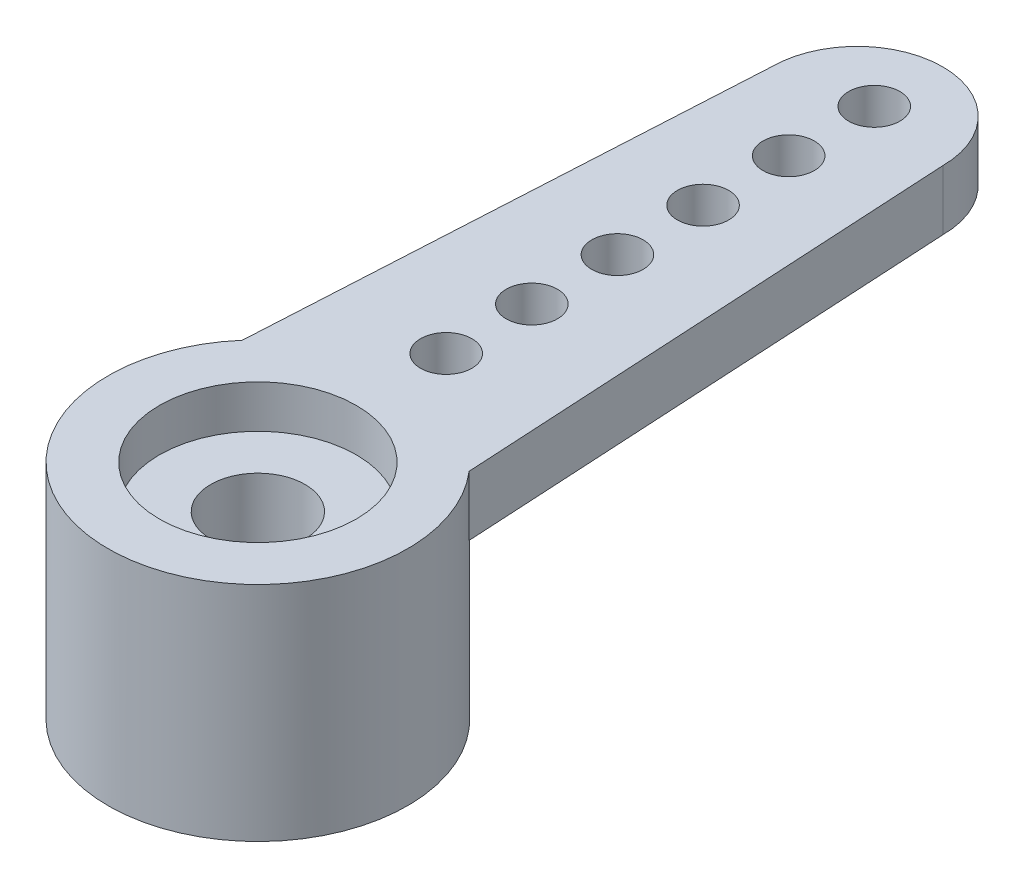
ISO-10303-21;
HEADER;
FILE_DESCRIPTION(('STEP AP214'),'2;1');
FILE_NAME('part.step','',(''),(''),'','','');
FILE_SCHEMA(('AUTOMOTIVE_DESIGN { 1 0 10303 214 1 1 1 1 }'));
ENDSEC;
DATA;
#1=APPLICATION_CONTEXT('core data for automotive mechanical design processes');
#2=APPLICATION_PROTOCOL_DEFINITION('international standard','automotive_design',2000,#1);
#3=PRODUCT_CONTEXT('',#1,'mechanical');
#4=PRODUCT('Part','Part','',(#3));
#5=PRODUCT_RELATED_PRODUCT_CATEGORY('part','',(#4));
#6=PRODUCT_DEFINITION_FORMATION('','',#4);
#7=PRODUCT_DEFINITION_CONTEXT('part definition',#1,'design');
#8=PRODUCT_DEFINITION('design','',#6,#7);
#9=PRODUCT_DEFINITION_SHAPE('','',#8);
#10=(LENGTH_UNIT() NAMED_UNIT(*) SI_UNIT(.MILLI.,.METRE.));
#11=(NAMED_UNIT(*) PLANE_ANGLE_UNIT() SI_UNIT($,.RADIAN.));
#12=(NAMED_UNIT(*) SI_UNIT($,.STERADIAN.) SOLID_ANGLE_UNIT());
#13=UNCERTAINTY_MEASURE_WITH_UNIT(LENGTH_MEASURE(1.E-05),#10,'distance_accuracy_value','');
#14=(GEOMETRIC_REPRESENTATION_CONTEXT(3) GLOBAL_UNCERTAINTY_ASSIGNED_CONTEXT((#13)) GLOBAL_UNIT_ASSIGNED_CONTEXT((#10,
#11,#12)) REPRESENTATION_CONTEXT('',''));
#15=CARTESIAN_POINT('',(0.,0.,0.));
#16=DIRECTION('',(0.,0.,1.));
#17=DIRECTION('',(1.,0.,0.));
#18=AXIS2_PLACEMENT_3D('',#15,#16,#17);
#19=CARTESIAN_POINT('',(-2.76834851479215,-1.4,-0.15361821615005));
#20=DIRECTION('',(-0.998463925245884,0.,-0.0554056854716381));
#21=DIRECTION('',(-0.0554056854716381,0.,0.998463925245884));
#22=AXIS2_PLACEMENT_3D('',#19,#20,#21);
#23=PLANE('',#22);
#24=DIRECTION('',(-0.0554056854716381,0.,0.998463925245884));
#25=VECTOR('',#24,1.);
#26=CARTESIAN_POINT('',(-2.76834851479215,0.,-0.15361821615005));
#27=LINE('',#26,#25);
#28=CARTESIAN_POINT('',(-2.,0.,-14.));
#29=VERTEX_POINT('',#28);
#30=CARTESIAN_POINT('',(-2.65,0.,-2.28637267303474));
#31=VERTEX_POINT('',#30);
#32=EDGE_CURVE('E132',#29,#31,#27,.T.);
#33=ORIENTED_EDGE('',*,*,#32,.F.);
#34=DIRECTION('',(0.,1.,0.));
#35=VECTOR('',#34,1.);
#36=CARTESIAN_POINT('',(-2.,-1.4,-14.));
#37=LINE('',#36,#35);
#38=CARTESIAN_POINT('',(-2.,-1.4,-14.));
#39=VERTEX_POINT('',#38);
#40=EDGE_CURVE('E51',#39,#29,#37,.T.);
#41=ORIENTED_EDGE('',*,*,#40,.F.);
#42=DIRECTION('',(-0.0554056854716381,0.,0.998463925245884));
#43=VECTOR('',#42,1.);
#44=CARTESIAN_POINT('',(-2.76834851479215,-1.4,-0.15361821615005));
#45=LINE('',#44,#43);
#46=CARTESIAN_POINT('',(-2.65,-1.4,-2.28637267303474));
#47=VERTEX_POINT('',#46);
#48=EDGE_CURVE('E99',#39,#47,#45,.T.);
#49=ORIENTED_EDGE('',*,*,#48,.T.);
#50=DIRECTION('',(0.,1.,0.));
#51=VECTOR('',#50,1.);
#52=CARTESIAN_POINT('',(-2.65,-1.4,-2.28637267303474));
#53=LINE('',#52,#51);
#54=EDGE_CURVE('E45',#47,#31,#53,.T.);
#55=ORIENTED_EDGE('',*,*,#54,.T.);
#56=EDGE_LOOP('',(#33,#41,#49,#55));
#57=FACE_BOUND('',#56,.T.);
#58=ADVANCED_FACE('F41',(#57),#23,.T.);
#59=CARTESIAN_POINT('',(0.,-1.4,-14.));
#60=DIRECTION('',(0.,1.,0.));
#61=DIRECTION('',(0.,0.,1.));
#62=AXIS2_PLACEMENT_3D('',#59,#60,#61);
#63=CYLINDRICAL_SURFACE('',#62,2.);
#64=CARTESIAN_POINT('',(0.,0.,-14.));
#65=DIRECTION('',(0.,1.,0.));
#66=DIRECTION('',(0.,0.,1.));
#67=AXIS2_PLACEMENT_3D('',#64,#65,#66);
#68=CIRCLE('',#67,2.);
#69=CARTESIAN_POINT('',(2.,0.,-14.));
#70=VERTEX_POINT('',#69);
#71=EDGE_CURVE('E136',#70,#29,#68,.T.);
#72=ORIENTED_EDGE('',*,*,#71,.F.);
#73=DIRECTION('',(0.,1.,0.));
#74=VECTOR('',#73,1.);
#75=CARTESIAN_POINT('',(2.,-1.4,-14.));
#76=LINE('',#75,#74);
#77=CARTESIAN_POINT('',(2.,-1.4,-14.));
#78=VERTEX_POINT('',#77);
#79=EDGE_CURVE('E77',#78,#70,#76,.T.);
#80=ORIENTED_EDGE('',*,*,#79,.F.);
#81=CARTESIAN_POINT('',(0.,-1.4,-14.));
#82=DIRECTION('',(0.,1.,0.));
#83=DIRECTION('',(0.,0.,1.));
#84=AXIS2_PLACEMENT_3D('',#81,#82,#83);
#85=CIRCLE('',#84,2.);
#86=EDGE_CURVE('E98',#78,#39,#85,.T.);
#87=ORIENTED_EDGE('',*,*,#86,.T.);
#88=ORIENTED_EDGE('',*,*,#40,.T.);
#89=EDGE_LOOP('',(#72,#80,#87,#88));
#90=FACE_BOUND('',#89,.T.);
#91=ADVANCED_FACE('F175',(#90),#63,.T.);
#92=CARTESIAN_POINT('',(2.76834851479215,-1.4,-0.153618216150051));
#93=DIRECTION('',(-0.998463925245884,0.,0.0554056854716383));
#94=DIRECTION('',(0.0554056854716384,0.,0.998463925245884));
#95=AXIS2_PLACEMENT_3D('',#92,#93,#94);
#96=PLANE('',#95);
#97=DIRECTION('',(0.0554056854716384,0.,0.998463925245884));
#98=VECTOR('',#97,1.);
#99=CARTESIAN_POINT('',(2.76834851479215,0.,-0.153618216150051));
#100=LINE('',#99,#98);
#101=CARTESIAN_POINT('',(2.65,0.,-2.28637267303474));
#102=VERTEX_POINT('',#101);
#103=EDGE_CURVE('E92',#70,#102,#100,.T.);
#104=ORIENTED_EDGE('',*,*,#103,.T.);
#105=DIRECTION('',(0.,1.,0.));
#106=VECTOR('',#105,1.);
#107=CARTESIAN_POINT('',(2.65,-1.4,-2.28637267303474));
#108=LINE('',#107,#106);
#109=CARTESIAN_POINT('',(2.65,-1.4,-2.28637267303474));
#110=VERTEX_POINT('',#109);
#111=EDGE_CURVE('E88',#110,#102,#108,.T.);
#112=ORIENTED_EDGE('',*,*,#111,.F.);
#113=DIRECTION('',(0.0554056854716384,0.,0.998463925245884));
#114=VECTOR('',#113,1.);
#115=CARTESIAN_POINT('',(2.76834851479215,-1.4,-0.153618216150051));
#116=LINE('',#115,#114);
#117=EDGE_CURVE('E90',#78,#110,#116,.T.);
#118=ORIENTED_EDGE('',*,*,#117,.F.);
#119=ORIENTED_EDGE('',*,*,#79,.T.);
#120=EDGE_LOOP('',(#104,#112,#118,#119));
#121=FACE_BOUND('',#120,.T.);
#122=ADVANCED_FACE('F89',(#121),#96,.F.);
#123=CARTESIAN_POINT('',(0.,-1.4,-14.4));
#124=DIRECTION('',(0.,1.,0.));
#125=DIRECTION('',(0.,0.,1.));
#126=AXIS2_PLACEMENT_3D('',#123,#124,#125);
#127=CYLINDRICAL_SURFACE('',#126,0.6);
#128=CARTESIAN_POINT('',(0.,-1.4,-14.4));
#129=DIRECTION('',(0.,1.,0.));
#130=DIRECTION('',(0.,0.,1.));
#131=AXIS2_PLACEMENT_3D('',#128,#129,#130);
#132=CIRCLE('',#131,0.6);
#133=CARTESIAN_POINT('',(0.,-1.4,-13.8));
#134=VERTEX_POINT('',#133);
#135=EDGE_CURVE('E105',#134,#134,#132,.T.);
#136=ORIENTED_EDGE('',*,*,#135,.F.);
#137=EDGE_LOOP('',(#136));
#138=FACE_BOUND('',#137,.T.);
#139=CARTESIAN_POINT('',(0.,0.,-14.4));
#140=DIRECTION('',(0.,1.,0.));
#141=DIRECTION('',(0.,0.,1.));
#142=AXIS2_PLACEMENT_3D('',#139,#140,#141);
#143=CIRCLE('',#142,0.6);
#144=CARTESIAN_POINT('',(0.,0.,-13.8));
#145=VERTEX_POINT('',#144);
#146=EDGE_CURVE('E129',#145,#145,#143,.T.);
#147=ORIENTED_EDGE('',*,*,#146,.T.);
#148=EDGE_LOOP('',(#147));
#149=FACE_BOUND('',#148,.T.);
#150=ADVANCED_FACE('F164',(#138,#149),#127,.F.);
#151=CARTESIAN_POINT('',(0.,-1.4,-12.4));
#152=DIRECTION('',(0.,1.,0.));
#153=DIRECTION('',(0.,0.,1.));
#154=AXIS2_PLACEMENT_3D('',#151,#152,#153);
#155=CYLINDRICAL_SURFACE('',#154,0.6);
#156=CARTESIAN_POINT('',(0.,-1.4,-12.4));
#157=DIRECTION('',(0.,1.,0.));
#158=DIRECTION('',(0.,0.,1.));
#159=AXIS2_PLACEMENT_3D('',#156,#157,#158);
#160=CIRCLE('',#159,0.6);
#161=CARTESIAN_POINT('',(0.,-1.4,-11.8));
#162=VERTEX_POINT('',#161);
#163=EDGE_CURVE('E108',#162,#162,#160,.T.);
#164=ORIENTED_EDGE('',*,*,#163,.F.);
#165=EDGE_LOOP('',(#164));
#166=FACE_BOUND('',#165,.T.);
#167=CARTESIAN_POINT('',(0.,0.,-12.4));
#168=DIRECTION('',(0.,1.,0.));
#169=DIRECTION('',(0.,0.,1.));
#170=AXIS2_PLACEMENT_3D('',#167,#168,#169);
#171=CIRCLE('',#170,0.6);
#172=CARTESIAN_POINT('',(0.,0.,-11.8));
#173=VERTEX_POINT('',#172);
#174=EDGE_CURVE('E126',#173,#173,#171,.T.);
#175=ORIENTED_EDGE('',*,*,#174,.T.);
#176=EDGE_LOOP('',(#175));
#177=FACE_BOUND('',#176,.T.);
#178=ADVANCED_FACE('F160',(#166,#177),#155,.F.);
#179=CARTESIAN_POINT('',(0.,-1.4,-10.4));
#180=DIRECTION('',(0.,1.,0.));
#181=DIRECTION('',(0.,0.,1.));
#182=AXIS2_PLACEMENT_3D('',#179,#180,#181);
#183=CYLINDRICAL_SURFACE('',#182,0.6);
#184=CARTESIAN_POINT('',(0.,-1.4,-10.4));
#185=DIRECTION('',(0.,1.,0.));
#186=DIRECTION('',(0.,0.,1.));
#187=AXIS2_PLACEMENT_3D('',#184,#185,#186);
#188=CIRCLE('',#187,0.6);
#189=CARTESIAN_POINT('',(0.,-1.4,-9.8));
#190=VERTEX_POINT('',#189);
#191=EDGE_CURVE('E153',#190,#190,#188,.T.);
#192=ORIENTED_EDGE('',*,*,#191,.F.);
#193=EDGE_LOOP('',(#192));
#194=FACE_BOUND('',#193,.T.);
#195=CARTESIAN_POINT('',(0.,0.,-10.4));
#196=DIRECTION('',(0.,1.,0.));
#197=DIRECTION('',(0.,0.,1.));
#198=AXIS2_PLACEMENT_3D('',#195,#196,#197);
#199=CIRCLE('',#198,0.6);
#200=CARTESIAN_POINT('',(0.,0.,-9.8));
#201=VERTEX_POINT('',#200);
#202=EDGE_CURVE('E123',#201,#201,#199,.T.);
#203=ORIENTED_EDGE('',*,*,#202,.T.);
#204=EDGE_LOOP('',(#203));
#205=FACE_BOUND('',#204,.T.);
#206=ADVANCED_FACE('F163',(#194,#205),#183,.F.);
#207=CARTESIAN_POINT('',(0.,-1.4,-8.4));
#208=DIRECTION('',(0.,1.,0.));
#209=DIRECTION('',(0.,0.,1.));
#210=AXIS2_PLACEMENT_3D('',#207,#208,#209);
#211=CYLINDRICAL_SURFACE('',#210,0.6);
#212=CARTESIAN_POINT('',(0.,-1.4,-8.4));
#213=DIRECTION('',(0.,1.,0.));
#214=DIRECTION('',(0.,0.,1.));
#215=AXIS2_PLACEMENT_3D('',#212,#213,#214);
#216=CIRCLE('',#215,0.6);
#217=CARTESIAN_POINT('',(0.,-1.4,-7.8));
#218=VERTEX_POINT('',#217);
#219=EDGE_CURVE('E147',#218,#218,#216,.T.);
#220=ORIENTED_EDGE('',*,*,#219,.F.);
#221=EDGE_LOOP('',(#220));
#222=FACE_BOUND('',#221,.T.);
#223=CARTESIAN_POINT('',(0.,0.,-8.4));
#224=DIRECTION('',(0.,1.,0.));
#225=DIRECTION('',(0.,0.,1.));
#226=AXIS2_PLACEMENT_3D('',#223,#224,#225);
#227=CIRCLE('',#226,0.6);
#228=CARTESIAN_POINT('',(0.,0.,-7.8));
#229=VERTEX_POINT('',#228);
#230=EDGE_CURVE('E120',#229,#229,#227,.T.);
#231=ORIENTED_EDGE('',*,*,#230,.T.);
#232=EDGE_LOOP('',(#231));
#233=FACE_BOUND('',#232,.T.);
#234=ADVANCED_FACE('F193',(#222,#233),#211,.F.);
#235=CARTESIAN_POINT('',(0.,-1.4,-6.4));
#236=DIRECTION('',(0.,1.,0.));
#237=DIRECTION('',(0.,0.,1.));
#238=AXIS2_PLACEMENT_3D('',#235,#236,#237);
#239=CYLINDRICAL_SURFACE('',#238,0.6);
#240=CARTESIAN_POINT('',(0.,-1.4,-6.4));
#241=DIRECTION('',(0.,1.,0.));
#242=DIRECTION('',(0.,0.,1.));
#243=AXIS2_PLACEMENT_3D('',#240,#241,#242);
#244=CIRCLE('',#243,0.6);
#245=CARTESIAN_POINT('',(0.,-1.4,-5.8));
#246=VERTEX_POINT('',#245);
#247=EDGE_CURVE('E143',#246,#246,#244,.T.);
#248=ORIENTED_EDGE('',*,*,#247,.F.);
#249=EDGE_LOOP('',(#248));
#250=FACE_BOUND('',#249,.T.);
#251=CARTESIAN_POINT('',(0.,0.,-6.4));
#252=DIRECTION('',(0.,1.,0.));
#253=DIRECTION('',(0.,0.,1.));
#254=AXIS2_PLACEMENT_3D('',#251,#252,#253);
#255=CIRCLE('',#254,0.6);
#256=CARTESIAN_POINT('',(0.,0.,-5.8));
#257=VERTEX_POINT('',#256);
#258=EDGE_CURVE('E116',#257,#257,#255,.T.);
#259=ORIENTED_EDGE('',*,*,#258,.T.);
#260=EDGE_LOOP('',(#259));
#261=FACE_BOUND('',#260,.T.);
#262=ADVANCED_FACE('F196',(#250,#261),#239,.F.);
#263=CARTESIAN_POINT('',(0.,-1.4,-4.4));
#264=DIRECTION('',(0.,1.,0.));
#265=DIRECTION('',(0.,0.,1.));
#266=AXIS2_PLACEMENT_3D('',#263,#264,#265);
#267=CYLINDRICAL_SURFACE('',#266,0.6);
#268=CARTESIAN_POINT('',(0.,-1.4,-4.4));
#269=DIRECTION('',(0.,1.,0.));
#270=DIRECTION('',(0.,0.,1.));
#271=AXIS2_PLACEMENT_3D('',#268,#269,#270);
#272=CIRCLE('',#271,0.6);
#273=CARTESIAN_POINT('',(0.,-1.4,-3.8));
#274=VERTEX_POINT('',#273);
#275=EDGE_CURVE('E139',#274,#274,#272,.T.);
#276=ORIENTED_EDGE('',*,*,#275,.F.);
#277=EDGE_LOOP('',(#276));
#278=FACE_BOUND('',#277,.T.);
#279=CARTESIAN_POINT('',(0.,0.,-4.4));
#280=DIRECTION('',(0.,1.,0.));
#281=DIRECTION('',(0.,0.,1.));
#282=AXIS2_PLACEMENT_3D('',#279,#280,#281);
#283=CIRCLE('',#282,0.6);
#284=CARTESIAN_POINT('',(0.,0.,-3.8));
#285=VERTEX_POINT('',#284);
#286=EDGE_CURVE('E113',#285,#285,#283,.T.);
#287=ORIENTED_EDGE('',*,*,#286,.T.);
#288=EDGE_LOOP('',(#287));
#289=FACE_BOUND('',#288,.T.);
#290=ADVANCED_FACE('F43',(#278,#289),#267,.F.);
#291=CARTESIAN_POINT('',(0.,-1.4,0.));
#292=DIRECTION('',(0.,1.,0.));
#293=DIRECTION('',(0.,0.,1.));
#294=AXIS2_PLACEMENT_3D('',#291,#292,#293);
#295=CYLINDRICAL_SURFACE('',#294,3.5);
#296=CARTESIAN_POINT('',(0.,0.,0.));
#297=DIRECTION('',(0.,1.,0.));
#298=DIRECTION('',(0.,0.,1.));
#299=AXIS2_PLACEMENT_3D('',#296,#297,#298);
#300=CIRCLE('',#299,3.5);
#301=EDGE_CURVE('E103',#31,#102,#300,.T.);
#302=ORIENTED_EDGE('',*,*,#301,.F.);
#303=ORIENTED_EDGE('',*,*,#54,.F.);
#304=CARTESIAN_POINT('',(0.,-1.4,0.));
#305=DIRECTION('',(0.,-1.,0.));
#306=DIRECTION('',(0.,0.,-1.));
#307=AXIS2_PLACEMENT_3D('',#304,#305,#306);
#308=CIRCLE('',#307,3.5);
#309=EDGE_CURVE('E11',#47,#110,#308,.T.);
#310=ORIENTED_EDGE('',*,*,#309,.T.);
#311=ORIENTED_EDGE('',*,*,#111,.T.);
#312=EDGE_LOOP('',(#302,#303,#310,#311));
#313=FACE_BOUND('',#312,.T.);
#314=CARTESIAN_POINT('',(0.,-5.2,0.));
#315=DIRECTION('',(0.,-1.,0.));
#316=DIRECTION('',(0.,0.,-1.));
#317=AXIS2_PLACEMENT_3D('',#314,#315,#316);
#318=CIRCLE('',#317,3.5);
#319=CARTESIAN_POINT('',(0.,-5.2,-3.5));
#320=VERTEX_POINT('',#319);
#321=EDGE_CURVE('E117',#320,#320,#318,.T.);
#322=ORIENTED_EDGE('',*,*,#321,.F.);
#323=EDGE_LOOP('',(#322));
#324=FACE_BOUND('',#323,.T.);
#325=ADVANCED_FACE('F101',(#313,#324),#295,.T.);
#326=CARTESIAN_POINT('',(0.,-1.4,0.));
#327=DIRECTION('',(0.,1.,0.));
#328=DIRECTION('',(0.,0.,1.));
#329=AXIS2_PLACEMENT_3D('',#326,#327,#328);
#330=PLANE('',#329);
#331=ORIENTED_EDGE('',*,*,#309,.F.);
#332=ORIENTED_EDGE('',*,*,#48,.F.);
#333=ORIENTED_EDGE('',*,*,#86,.F.);
#334=ORIENTED_EDGE('',*,*,#117,.T.);
#335=EDGE_LOOP('',(#331,#332,#333,#334));
#336=FACE_BOUND('',#335,.T.);
#337=ORIENTED_EDGE('',*,*,#275,.T.);
#338=EDGE_LOOP('',(#337));
#339=FACE_BOUND('',#338,.T.);
#340=ORIENTED_EDGE('',*,*,#247,.T.);
#341=EDGE_LOOP('',(#340));
#342=FACE_BOUND('',#341,.T.);
#343=ORIENTED_EDGE('',*,*,#219,.T.);
#344=EDGE_LOOP('',(#343));
#345=FACE_BOUND('',#344,.T.);
#346=ORIENTED_EDGE('',*,*,#191,.T.);
#347=EDGE_LOOP('',(#346));
#348=FACE_BOUND('',#347,.T.);
#349=ORIENTED_EDGE('',*,*,#163,.T.);
#350=EDGE_LOOP('',(#349));
#351=FACE_BOUND('',#350,.T.);
#352=ORIENTED_EDGE('',*,*,#135,.T.);
#353=EDGE_LOOP('',(#352));
#354=FACE_BOUND('',#353,.T.);
#355=ADVANCED_FACE('F96',(#336,#339,#342,#345,#348,#351,#354),#330,.F.);
#356=CARTESIAN_POINT('',(0.,0.,0.));
#357=DIRECTION('',(0.,1.,0.));
#358=DIRECTION('',(0.,0.,1.));
#359=AXIS2_PLACEMENT_3D('',#356,#357,#358);
#360=PLANE('',#359);
#361=CARTESIAN_POINT('',(0.,0.,0.));
#362=DIRECTION('',(0.,1.,0.));
#363=DIRECTION('',(0.,0.,1.));
#364=AXIS2_PLACEMENT_3D('',#361,#362,#363);
#365=CIRCLE('',#364,2.3);
#366=CARTESIAN_POINT('',(0.,0.,2.3));
#367=VERTEX_POINT('',#366);
#368=EDGE_CURVE('E262',#367,#367,#365,.T.);
#369=ORIENTED_EDGE('',*,*,#368,.F.);
#370=EDGE_LOOP('',(#369));
#371=FACE_BOUND('',#370,.T.);
#372=ORIENTED_EDGE('',*,*,#286,.F.);
#373=EDGE_LOOP('',(#372));
#374=FACE_BOUND('',#373,.T.);
#375=ORIENTED_EDGE('',*,*,#258,.F.);
#376=EDGE_LOOP('',(#375));
#377=FACE_BOUND('',#376,.T.);
#378=ORIENTED_EDGE('',*,*,#230,.F.);
#379=EDGE_LOOP('',(#378));
#380=FACE_BOUND('',#379,.T.);
#381=ORIENTED_EDGE('',*,*,#202,.F.);
#382=EDGE_LOOP('',(#381));
#383=FACE_BOUND('',#382,.T.);
#384=ORIENTED_EDGE('',*,*,#174,.F.);
#385=EDGE_LOOP('',(#384));
#386=FACE_BOUND('',#385,.T.);
#387=ORIENTED_EDGE('',*,*,#146,.F.);
#388=EDGE_LOOP('',(#387));
#389=FACE_BOUND('',#388,.T.);
#390=ORIENTED_EDGE('',*,*,#32,.T.);
#391=ORIENTED_EDGE('',*,*,#301,.T.);
#392=ORIENTED_EDGE('',*,*,#103,.F.);
#393=ORIENTED_EDGE('',*,*,#71,.T.);
#394=EDGE_LOOP('',(#390,#391,#392,#393));
#395=FACE_BOUND('',#394,.T.);
#396=ADVANCED_FACE('F168',(#371,#374,#377,#380,#383,#386,#389,#395),#360,.T.);
#397=CARTESIAN_POINT('',(0.,-5.2,0.));
#398=DIRECTION('',(0.,-1.,0.));
#399=DIRECTION('',(0.,0.,-1.));
#400=AXIS2_PLACEMENT_3D('',#397,#398,#399);
#401=PLANE('',#400);
#402=CARTESIAN_POINT('',(0.,-5.2,0.));
#403=DIRECTION('',(0.,-1.,0.));
#404=DIRECTION('',(0.,0.,-1.));
#405=AXIS2_PLACEMENT_3D('',#402,#403,#404);
#406=CIRCLE('',#405,2.5);
#407=CARTESIAN_POINT('',(0.,-5.2,-2.5));
#408=VERTEX_POINT('',#407);
#409=EDGE_CURVE('E254',#408,#408,#406,.T.);
#410=ORIENTED_EDGE('',*,*,#409,.F.);
#411=EDGE_LOOP('',(#410));
#412=FACE_BOUND('',#411,.T.);
#413=ORIENTED_EDGE('',*,*,#321,.T.);
#414=EDGE_LOOP('',(#413));
#415=FACE_BOUND('',#414,.T.);
#416=ADVANCED_FACE('F171',(#412,#415),#401,.T.);
#417=CARTESIAN_POINT('',(0.,-1.,0.));
#418=DIRECTION('',(0.,1.,0.));
#419=DIRECTION('',(0.,0.,1.));
#420=AXIS2_PLACEMENT_3D('',#417,#418,#419);
#421=CYLINDRICAL_SURFACE('',#420,2.3);
#422=CARTESIAN_POINT('',(0.,-1.,0.));
#423=DIRECTION('',(0.,1.,0.));
#424=DIRECTION('',(0.,0.,1.));
#425=AXIS2_PLACEMENT_3D('',#422,#423,#424);
#426=CIRCLE('',#425,2.3);
#427=CARTESIAN_POINT('',(0.,-1.,2.3));
#428=VERTEX_POINT('',#427);
#429=EDGE_CURVE('E264',#428,#428,#426,.T.);
#430=ORIENTED_EDGE('',*,*,#429,.F.);
#431=EDGE_LOOP('',(#430));
#432=FACE_BOUND('',#431,.T.);
#433=ORIENTED_EDGE('',*,*,#368,.T.);
#434=EDGE_LOOP('',(#433));
#435=FACE_BOUND('',#434,.T.);
#436=ADVANCED_FACE('F225',(#432,#435),#421,.F.);
#437=CARTESIAN_POINT('',(0.,-1.,0.));
#438=DIRECTION('',(0.,1.,0.));
#439=DIRECTION('',(0.,0.,1.));
#440=AXIS2_PLACEMENT_3D('',#437,#438,#439);
#441=PLANE('',#440);
#442=CARTESIAN_POINT('',(0.,-1.,0.));
#443=DIRECTION('',(0.,1.,0.));
#444=DIRECTION('',(0.,0.,1.));
#445=AXIS2_PLACEMENT_3D('',#442,#443,#444);
#446=CIRCLE('',#445,1.10218213753583);
#447=CARTESIAN_POINT('',(0.,-1.,1.10218213753583));
#448=VERTEX_POINT('',#447);
#449=EDGE_CURVE('E253',#448,#448,#446,.T.);
#450=ORIENTED_EDGE('',*,*,#449,.F.);
#451=EDGE_LOOP('',(#450));
#452=FACE_BOUND('',#451,.T.);
#453=ORIENTED_EDGE('',*,*,#429,.T.);
#454=EDGE_LOOP('',(#453));
#455=FACE_BOUND('',#454,.T.);
#456=ADVANCED_FACE('F229',(#452,#455),#441,.T.);
#457=CARTESIAN_POINT('',(0.,-3.2,0.));
#458=DIRECTION('',(0.,-1.,0.));
#459=DIRECTION('',(0.,0.,-1.));
#460=AXIS2_PLACEMENT_3D('',#457,#458,#459);
#461=CYLINDRICAL_SURFACE('',#460,2.5);
#462=CARTESIAN_POINT('',(0.,-3.2,0.));
#463=DIRECTION('',(0.,-1.,0.));
#464=DIRECTION('',(0.,0.,-1.));
#465=AXIS2_PLACEMENT_3D('',#462,#463,#464);
#466=CIRCLE('',#465,2.5);
#467=CARTESIAN_POINT('',(0.,-3.2,-2.5));
#468=VERTEX_POINT('',#467);
#469=EDGE_CURVE('E257',#468,#468,#466,.T.);
#470=ORIENTED_EDGE('',*,*,#469,.F.);
#471=EDGE_LOOP('',(#470));
#472=FACE_BOUND('',#471,.T.);
#473=ORIENTED_EDGE('',*,*,#409,.T.);
#474=EDGE_LOOP('',(#473));
#475=FACE_BOUND('',#474,.T.);
#476=ADVANCED_FACE('F233',(#472,#475),#461,.F.);
#477=CARTESIAN_POINT('',(0.,-3.2,0.));
#478=DIRECTION('',(0.,-1.,0.));
#479=DIRECTION('',(0.,0.,-1.));
#480=AXIS2_PLACEMENT_3D('',#477,#478,#479);
#481=PLANE('',#480);
#482=CARTESIAN_POINT('',(0.,-3.2,0.));
#483=DIRECTION('',(0.,-1.,0.));
#484=DIRECTION('',(0.,0.,-1.));
#485=AXIS2_PLACEMENT_3D('',#482,#483,#484);
#486=CIRCLE('',#485,1.10218213753583);
#487=CARTESIAN_POINT('',(0.,-3.2,-1.10218213753583));
#488=VERTEX_POINT('',#487);
#489=EDGE_CURVE('E250',#488,#488,#486,.F.);
#490=ORIENTED_EDGE('',*,*,#489,.T.);
#491=EDGE_LOOP('',(#490));
#492=FACE_BOUND('',#491,.T.);
#493=ORIENTED_EDGE('',*,*,#469,.T.);
#494=EDGE_LOOP('',(#493));
#495=FACE_BOUND('',#494,.T.);
#496=ADVANCED_FACE('F237',(#492,#495),#481,.T.);
#497=CARTESIAN_POINT('',(0.,-5.201,0.));
#498=DIRECTION('',(0.,1.,0.));
#499=DIRECTION('',(0.,0.,1.));
#500=AXIS2_PLACEMENT_3D('',#497,#498,#499);
#501=CYLINDRICAL_SURFACE('',#500,1.10218213753583);
#502=ORIENTED_EDGE('',*,*,#489,.F.);
#503=EDGE_LOOP('',(#502));
#504=FACE_BOUND('',#503,.T.);
#505=ORIENTED_EDGE('',*,*,#449,.T.);
#506=EDGE_LOOP('',(#505));
#507=FACE_BOUND('',#506,.T.);
#508=ADVANCED_FACE('F241',(#504,#507),#501,.F.);
#509=CLOSED_SHELL('',(#58,#91,#122,#150,#178,#206,#234,#262,#290,#325,#355,#396,#416,#436,#456,
#476,#496,#508));
#510=MANIFOLD_SOLID_BREP('B2',#509);
#511=ADVANCED_BREP_SHAPE_REPRESENTATION('',(#18,#510),#14);
#512=SHAPE_DEFINITION_REPRESENTATION(#9,#511);
ENDSEC;
END-ISO-10303-21;
